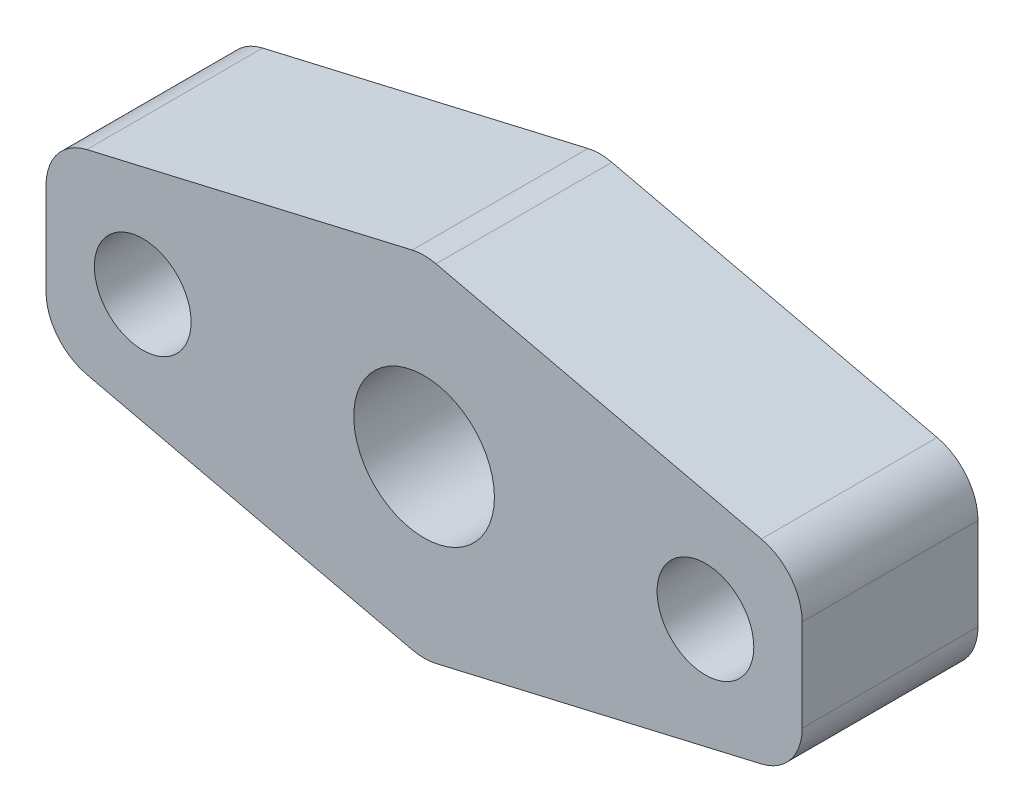
ISO-10303-21;
HEADER;
FILE_DESCRIPTION(('STEP AP214'),'2;1');
FILE_NAME('part.step','',(''),(''),'','','');
FILE_SCHEMA(('AUTOMOTIVE_DESIGN { 1 0 10303 214 1 1 1 1 }'));
ENDSEC;
DATA;
#1=APPLICATION_CONTEXT('core data for automotive mechanical design processes');
#2=APPLICATION_PROTOCOL_DEFINITION('international standard','automotive_design',2000,#1);
#3=PRODUCT_CONTEXT('',#1,'mechanical');
#4=PRODUCT('Part','Part','',(#3));
#5=PRODUCT_RELATED_PRODUCT_CATEGORY('part','',(#4));
#6=PRODUCT_DEFINITION_FORMATION('','',#4);
#7=PRODUCT_DEFINITION_CONTEXT('part definition',#1,'design');
#8=PRODUCT_DEFINITION('design','',#6,#7);
#9=PRODUCT_DEFINITION_SHAPE('','',#8);
#10=(LENGTH_UNIT() NAMED_UNIT(*) SI_UNIT(.MILLI.,.METRE.));
#11=(NAMED_UNIT(*) PLANE_ANGLE_UNIT() SI_UNIT($,.RADIAN.));
#12=(NAMED_UNIT(*) SI_UNIT($,.STERADIAN.) SOLID_ANGLE_UNIT());
#13=UNCERTAINTY_MEASURE_WITH_UNIT(LENGTH_MEASURE(1.E-05),#10,'distance_accuracy_value','');
#14=(GEOMETRIC_REPRESENTATION_CONTEXT(3) GLOBAL_UNCERTAINTY_ASSIGNED_CONTEXT((#13)) GLOBAL_UNIT_ASSIGNED_CONTEXT((#10,
#11,#12)) REPRESENTATION_CONTEXT('',''));
#15=CARTESIAN_POINT('',(0.,0.,0.));
#16=DIRECTION('',(0.,0.,1.));
#17=DIRECTION('',(1.,0.,0.));
#18=AXIS2_PLACEMENT_3D('',#15,#16,#17);
#19=CARTESIAN_POINT('',(0.,0.,10.));
#20=DIRECTION('',(0.,0.,1.));
#21=DIRECTION('',(1.,0.,0.));
#22=AXIS2_PLACEMENT_3D('',#19,#20,#21);
#23=PLANE('',#22);
#24=CARTESIAN_POINT('',(-16.,0.,10.));
#25=DIRECTION('',(0.,0.,1.));
#26=DIRECTION('',(1.,0.,0.));
#27=AXIS2_PLACEMENT_3D('',#24,#25,#26);
#28=CIRCLE('',#27,2.75);
#29=CARTESIAN_POINT('',(-13.25,0.,10.));
#30=VERTEX_POINT('',#29);
#31=EDGE_CURVE('E238',#30,#30,#28,.T.);
#32=ORIENTED_EDGE('',*,*,#31,.F.);
#33=EDGE_LOOP('',(#32));
#34=FACE_BOUND('',#33,.T.);
#35=DIRECTION('',(0.974008027039196,-0.226513494660278,0.));
#36=VECTOR('',#35,1.);
#37=CARTESIAN_POINT('',(0.,-10.,10.));
#38=LINE('',#37,#36);
#39=CARTESIAN_POINT('',(-19.1795404839808,-5.53964174791143,10.));
#40=VERTEX_POINT('',#39);
#41=CARTESIAN_POINT('',(-0.679540483980835,-9.84196732930678,10.));
#42=VERTEX_POINT('',#41);
#43=EDGE_CURVE('E229',#40,#42,#38,.T.);
#44=ORIENTED_EDGE('',*,*,#43,.T.);
#45=CARTESIAN_POINT('',(0.,-6.9199432481892,10.));
#46=DIRECTION('',(0.,0.,1.));
#47=DIRECTION('',(1.,0.,0.));
#48=AXIS2_PLACEMENT_3D('',#45,#46,#47);
#49=CIRCLE('',#48,3.);
#50=CARTESIAN_POINT('',(0.679540483980834,-9.84196732930678,10.));
#51=VERTEX_POINT('',#50);
#52=EDGE_CURVE('E181',#42,#51,#49,.T.);
#53=ORIENTED_EDGE('',*,*,#52,.T.);
#54=DIRECTION('',(0.974008027039197,0.226513494660278,0.));
#55=VECTOR('',#54,1.);
#56=CARTESIAN_POINT('',(21.5,-5.,10.));
#57=LINE('',#56,#55);
#58=CARTESIAN_POINT('',(19.1795404839808,-5.53964174791144,10.));
#59=VERTEX_POINT('',#58);
#60=EDGE_CURVE('E143',#51,#59,#57,.T.);
#61=ORIENTED_EDGE('',*,*,#60,.T.);
#62=CARTESIAN_POINT('',(18.5,-2.61761766679385,10.));
#63=DIRECTION('',(0.,0.,1.));
#64=DIRECTION('',(1.,0.,0.));
#65=AXIS2_PLACEMENT_3D('',#62,#63,#64);
#66=CIRCLE('',#65,3.);
#67=CARTESIAN_POINT('',(21.5,-2.61761766679385,10.));
#68=VERTEX_POINT('',#67);
#69=EDGE_CURVE('E55',#59,#68,#66,.T.);
#70=ORIENTED_EDGE('',*,*,#69,.T.);
#71=DIRECTION('',(0.,1.,0.));
#72=VECTOR('',#71,1.);
#73=CARTESIAN_POINT('',(21.5,-5.,10.));
#74=LINE('',#73,#72);
#75=CARTESIAN_POINT('',(21.5,2.61761766679384,10.));
#76=VERTEX_POINT('',#75);
#77=EDGE_CURVE('E160',#68,#76,#74,.T.);
#78=ORIENTED_EDGE('',*,*,#77,.T.);
#79=CARTESIAN_POINT('',(18.5,2.61761766679384,10.));
#80=DIRECTION('',(0.,0.,1.));
#81=DIRECTION('',(1.,0.,0.));
#82=AXIS2_PLACEMENT_3D('',#79,#80,#81);
#83=CIRCLE('',#82,3.);
#84=CARTESIAN_POINT('',(19.1795404839808,5.53964174791143,10.));
#85=VERTEX_POINT('',#84);
#86=EDGE_CURVE('E174',#76,#85,#83,.T.);
#87=ORIENTED_EDGE('',*,*,#86,.T.);
#88=DIRECTION('',(-0.974008027039197,0.226513494660278,0.));
#89=VECTOR('',#88,1.);
#90=CARTESIAN_POINT('',(0.,10.,10.));
#91=LINE('',#90,#89);
#92=CARTESIAN_POINT('',(0.679540483980838,9.84196732930678,10.));
#93=VERTEX_POINT('',#92);
#94=EDGE_CURVE('E154',#85,#93,#91,.T.);
#95=ORIENTED_EDGE('',*,*,#94,.T.);
#96=CARTESIAN_POINT('',(0.,6.91994324818919,10.));
#97=DIRECTION('',(0.,0.,1.));
#98=DIRECTION('',(1.,0.,0.));
#99=AXIS2_PLACEMENT_3D('',#96,#97,#98);
#100=CIRCLE('',#99,3.);
#101=CARTESIAN_POINT('',(-0.679540483980831,9.84196732930678,10.));
#102=VERTEX_POINT('',#101);
#103=EDGE_CURVE('E172',#93,#102,#100,.T.);
#104=ORIENTED_EDGE('',*,*,#103,.T.);
#105=DIRECTION('',(-0.974008027039197,-0.226513494660278,0.));
#106=VECTOR('',#105,1.);
#107=CARTESIAN_POINT('',(0.,10.,10.));
#108=LINE('',#107,#106);
#109=CARTESIAN_POINT('',(-19.1795404839808,5.53964174791144,10.));
#110=VERTEX_POINT('',#109);
#111=EDGE_CURVE('E212',#102,#110,#108,.T.);
#112=ORIENTED_EDGE('',*,*,#111,.T.);
#113=CARTESIAN_POINT('',(-18.5,2.61761766679385,10.));
#114=DIRECTION('',(0.,0.,1.));
#115=DIRECTION('',(1.,0.,0.));
#116=AXIS2_PLACEMENT_3D('',#113,#114,#115);
#117=CIRCLE('',#116,3.);
#118=CARTESIAN_POINT('',(-21.5,2.61761766679385,10.));
#119=VERTEX_POINT('',#118);
#120=EDGE_CURVE('E177',#110,#119,#117,.T.);
#121=ORIENTED_EDGE('',*,*,#120,.T.);
#122=DIRECTION('',(0.,-1.,0.));
#123=VECTOR('',#122,1.);
#124=CARTESIAN_POINT('',(-21.5,-5.,10.));
#125=LINE('',#124,#123);
#126=CARTESIAN_POINT('',(-21.5,-2.61761766679384,10.));
#127=VERTEX_POINT('',#126);
#128=EDGE_CURVE('E231',#119,#127,#125,.T.);
#129=ORIENTED_EDGE('',*,*,#128,.T.);
#130=CARTESIAN_POINT('',(-18.5,-2.61761766679384,10.));
#131=DIRECTION('',(0.,0.,1.));
#132=DIRECTION('',(1.,0.,0.));
#133=AXIS2_PLACEMENT_3D('',#130,#131,#132);
#134=CIRCLE('',#133,3.);
#135=EDGE_CURVE('E179',#127,#40,#134,.T.);
#136=ORIENTED_EDGE('',*,*,#135,.T.);
#137=EDGE_LOOP('',(#44,#53,#61,#70,#78,#87,#95,#104,#112,#121,#129,#136));
#138=FACE_BOUND('',#137,.T.);
#139=CARTESIAN_POINT('',(0.,0.,10.));
#140=DIRECTION('',(0.,0.,1.));
#141=DIRECTION('',(1.,0.,0.));
#142=AXIS2_PLACEMENT_3D('',#139,#140,#141);
#143=CIRCLE('',#142,4.);
#144=CARTESIAN_POINT('',(4.00000000000001,0.,10.));
#145=VERTEX_POINT('',#144);
#146=EDGE_CURVE('E224',#145,#145,#143,.T.);
#147=ORIENTED_EDGE('',*,*,#146,.F.);
#148=EDGE_LOOP('',(#147));
#149=FACE_BOUND('',#148,.T.);
#150=CARTESIAN_POINT('',(16.,0.,10.));
#151=DIRECTION('',(0.,0.,1.));
#152=DIRECTION('',(1.,0.,0.));
#153=AXIS2_PLACEMENT_3D('',#150,#151,#152);
#154=CIRCLE('',#153,2.75);
#155=CARTESIAN_POINT('',(18.75,0.,10.));
#156=VERTEX_POINT('',#155);
#157=EDGE_CURVE('E244',#156,#156,#154,.T.);
#158=ORIENTED_EDGE('',*,*,#157,.F.);
#159=EDGE_LOOP('',(#158));
#160=FACE_BOUND('',#159,.T.);
#161=ADVANCED_FACE('F33',(#34,#138,#149,#160),#23,.T.);
#162=CARTESIAN_POINT('',(0.,0.,0.));
#163=DIRECTION('',(0.,0.,1.));
#164=DIRECTION('',(1.,0.,0.));
#165=AXIS2_PLACEMENT_3D('',#162,#163,#164);
#166=PLANE('',#165);
#167=DIRECTION('',(0.974008027039197,0.226513494660278,0.));
#168=VECTOR('',#167,1.);
#169=CARTESIAN_POINT('',(21.5,-5.,0.));
#170=LINE('',#169,#168);
#171=CARTESIAN_POINT('',(0.679540483980834,-9.84196732930678,0.));
#172=VERTEX_POINT('',#171);
#173=CARTESIAN_POINT('',(19.1795404839808,-5.53964174791144,0.));
#174=VERTEX_POINT('',#173);
#175=EDGE_CURVE('E141',#172,#174,#170,.T.);
#176=ORIENTED_EDGE('',*,*,#175,.F.);
#177=CARTESIAN_POINT('',(0.,-6.9199432481892,0.));
#178=DIRECTION('',(0.,0.,1.));
#179=DIRECTION('',(1.,0.,0.));
#180=AXIS2_PLACEMENT_3D('',#177,#178,#179);
#181=CIRCLE('',#180,3.);
#182=CARTESIAN_POINT('',(-0.679540483980835,-9.84196732930678,0.));
#183=VERTEX_POINT('',#182);
#184=EDGE_CURVE('E124',#172,#183,#181,.F.);
#185=ORIENTED_EDGE('',*,*,#184,.T.);
#186=DIRECTION('',(0.974008027039196,-0.226513494660278,0.));
#187=VECTOR('',#186,1.);
#188=CARTESIAN_POINT('',(0.,-10.,0.));
#189=LINE('',#188,#187);
#190=CARTESIAN_POINT('',(-19.1795404839808,-5.53964174791143,0.));
#191=VERTEX_POINT('',#190);
#192=EDGE_CURVE('E152',#191,#183,#189,.T.);
#193=ORIENTED_EDGE('',*,*,#192,.F.);
#194=CARTESIAN_POINT('',(-18.5,-2.61761766679384,0.));
#195=DIRECTION('',(0.,0.,1.));
#196=DIRECTION('',(1.,0.,0.));
#197=AXIS2_PLACEMENT_3D('',#194,#195,#196);
#198=CIRCLE('',#197,3.);
#199=CARTESIAN_POINT('',(-21.5,-2.61761766679384,0.));
#200=VERTEX_POINT('',#199);
#201=EDGE_CURVE('E135',#191,#200,#198,.F.);
#202=ORIENTED_EDGE('',*,*,#201,.T.);
#203=DIRECTION('',(0.,-1.,0.));
#204=VECTOR('',#203,1.);
#205=CARTESIAN_POINT('',(-21.5,-5.,0.));
#206=LINE('',#205,#204);
#207=CARTESIAN_POINT('',(-21.5,2.61761766679385,0.));
#208=VERTEX_POINT('',#207);
#209=EDGE_CURVE('E156',#208,#200,#206,.T.);
#210=ORIENTED_EDGE('',*,*,#209,.F.);
#211=CARTESIAN_POINT('',(-18.5,2.61761766679385,0.));
#212=DIRECTION('',(0.,0.,1.));
#213=DIRECTION('',(1.,0.,0.));
#214=AXIS2_PLACEMENT_3D('',#211,#212,#213);
#215=CIRCLE('',#214,3.);
#216=CARTESIAN_POINT('',(-19.1795404839808,5.53964174791144,0.));
#217=VERTEX_POINT('',#216);
#218=EDGE_CURVE('E166',#208,#217,#215,.F.);
#219=ORIENTED_EDGE('',*,*,#218,.T.);
#220=DIRECTION('',(-0.974008027039197,-0.226513494660278,0.));
#221=VECTOR('',#220,1.);
#222=CARTESIAN_POINT('',(0.,10.,0.));
#223=LINE('',#222,#221);
#224=CARTESIAN_POINT('',(-0.679540483980831,9.84196732930678,0.));
#225=VERTEX_POINT('',#224);
#226=EDGE_CURVE('E219',#225,#217,#223,.T.);
#227=ORIENTED_EDGE('',*,*,#226,.F.);
#228=CARTESIAN_POINT('',(0.,6.91994324818919,0.));
#229=DIRECTION('',(0.,0.,1.));
#230=DIRECTION('',(1.,0.,0.));
#231=AXIS2_PLACEMENT_3D('',#228,#229,#230);
#232=CIRCLE('',#231,3.);
#233=CARTESIAN_POINT('',(0.679540483980838,9.84196732930678,0.));
#234=VERTEX_POINT('',#233);
#235=EDGE_CURVE('E144',#225,#234,#232,.F.);
#236=ORIENTED_EDGE('',*,*,#235,.T.);
#237=DIRECTION('',(-0.974008027039197,0.226513494660278,0.));
#238=VECTOR('',#237,1.);
#239=CARTESIAN_POINT('',(0.,10.,0.));
#240=LINE('',#239,#238);
#241=CARTESIAN_POINT('',(19.1795404839808,5.53964174791143,0.));
#242=VERTEX_POINT('',#241);
#243=EDGE_CURVE('E204',#242,#234,#240,.T.);
#244=ORIENTED_EDGE('',*,*,#243,.F.);
#245=CARTESIAN_POINT('',(18.5,2.61761766679384,0.));
#246=DIRECTION('',(0.,0.,1.));
#247=DIRECTION('',(1.,0.,0.));
#248=AXIS2_PLACEMENT_3D('',#245,#246,#247);
#249=CIRCLE('',#248,3.);
#250=CARTESIAN_POINT('',(21.5,2.61761766679384,0.));
#251=VERTEX_POINT('',#250);
#252=EDGE_CURVE('E163',#242,#251,#249,.F.);
#253=ORIENTED_EDGE('',*,*,#252,.T.);
#254=DIRECTION('',(0.,1.,0.));
#255=VECTOR('',#254,1.);
#256=CARTESIAN_POINT('',(21.5,-5.,0.));
#257=LINE('',#256,#255);
#258=CARTESIAN_POINT('',(21.5,-2.61761766679385,0.));
#259=VERTEX_POINT('',#258);
#260=EDGE_CURVE('E151',#259,#251,#257,.T.);
#261=ORIENTED_EDGE('',*,*,#260,.F.);
#262=CARTESIAN_POINT('',(18.5,-2.61761766679385,0.));
#263=DIRECTION('',(0.,0.,1.));
#264=DIRECTION('',(1.,0.,0.));
#265=AXIS2_PLACEMENT_3D('',#262,#263,#264);
#266=CIRCLE('',#265,3.);
#267=EDGE_CURVE('E150',#259,#174,#266,.F.);
#268=ORIENTED_EDGE('',*,*,#267,.T.);
#269=EDGE_LOOP('',(#176,#185,#193,#202,#210,#219,#227,#236,#244,#253,#261,#268));
#270=FACE_BOUND('',#269,.T.);
#271=CARTESIAN_POINT('',(0.,0.,0.));
#272=DIRECTION('',(0.,0.,1.));
#273=DIRECTION('',(1.,0.,0.));
#274=AXIS2_PLACEMENT_3D('',#271,#272,#273);
#275=CIRCLE('',#274,4.);
#276=CARTESIAN_POINT('',(4.00000000000001,0.,0.));
#277=VERTEX_POINT('',#276);
#278=EDGE_CURVE('E235',#277,#277,#275,.T.);
#279=ORIENTED_EDGE('',*,*,#278,.T.);
#280=EDGE_LOOP('',(#279));
#281=FACE_BOUND('',#280,.T.);
#282=CARTESIAN_POINT('',(-16.,0.,0.));
#283=DIRECTION('',(0.,0.,1.));
#284=DIRECTION('',(1.,0.,0.));
#285=AXIS2_PLACEMENT_3D('',#282,#283,#284);
#286=CIRCLE('',#285,2.75);
#287=CARTESIAN_POINT('',(-13.25,0.,0.));
#288=VERTEX_POINT('',#287);
#289=EDGE_CURVE('E241',#288,#288,#286,.T.);
#290=ORIENTED_EDGE('',*,*,#289,.T.);
#291=EDGE_LOOP('',(#290));
#292=FACE_BOUND('',#291,.T.);
#293=CARTESIAN_POINT('',(16.,0.,0.));
#294=DIRECTION('',(0.,0.,1.));
#295=DIRECTION('',(1.,0.,0.));
#296=AXIS2_PLACEMENT_3D('',#293,#294,#295);
#297=CIRCLE('',#296,2.75);
#298=CARTESIAN_POINT('',(18.75,0.,0.));
#299=VERTEX_POINT('',#298);
#300=EDGE_CURVE('E247',#299,#299,#297,.T.);
#301=ORIENTED_EDGE('',*,*,#300,.T.);
#302=EDGE_LOOP('',(#301));
#303=FACE_BOUND('',#302,.T.);
#304=ADVANCED_FACE('F147',(#270,#281,#292,#303),#166,.F.);
#305=CARTESIAN_POINT('',(0.,10.,10.));
#306=DIRECTION('',(-0.226513494660278,-0.974008027039196,0.));
#307=DIRECTION('',(0.974008027039196,-0.226513494660278,0.));
#308=AXIS2_PLACEMENT_3D('',#305,#306,#307);
#309=PLANE('',#308);
#310=ORIENTED_EDGE('',*,*,#94,.F.);
#311=DIRECTION('',(0.,0.,-1.));
#312=VECTOR('',#311,1.);
#313=CARTESIAN_POINT('',(19.1795404839808,5.53964174791143,10.));
#314=LINE('',#313,#312);
#315=EDGE_CURVE('E11',#85,#242,#314,.T.);
#316=ORIENTED_EDGE('',*,*,#315,.T.);
#317=ORIENTED_EDGE('',*,*,#243,.T.);
#318=DIRECTION('',(0.,0.,-1.));
#319=VECTOR('',#318,1.);
#320=CARTESIAN_POINT('',(0.679540483980838,9.84196732930678,10.));
#321=LINE('',#320,#319);
#322=EDGE_CURVE('E41',#234,#93,#321,.F.);
#323=ORIENTED_EDGE('',*,*,#322,.T.);
#324=EDGE_LOOP('',(#310,#316,#317,#323));
#325=FACE_BOUND('',#324,.T.);
#326=ADVANCED_FACE('F201',(#325),#309,.F.);
#327=CARTESIAN_POINT('',(0.,10.,10.));
#328=DIRECTION('',(0.226513494660278,-0.974008027039197,0.));
#329=DIRECTION('',(0.974008027039197,0.226513494660278,0.));
#330=AXIS2_PLACEMENT_3D('',#327,#328,#329);
#331=PLANE('',#330);
#332=ORIENTED_EDGE('',*,*,#226,.T.);
#333=DIRECTION('',(0.,0.,-1.));
#334=VECTOR('',#333,1.);
#335=CARTESIAN_POINT('',(-19.1795404839808,5.53964174791144,10.));
#336=LINE('',#335,#334);
#337=EDGE_CURVE('E191',#217,#110,#336,.F.);
#338=ORIENTED_EDGE('',*,*,#337,.T.);
#339=ORIENTED_EDGE('',*,*,#111,.F.);
#340=DIRECTION('',(0.,0.,-1.));
#341=VECTOR('',#340,1.);
#342=CARTESIAN_POINT('',(-0.679540483980831,9.84196732930678,10.));
#343=LINE('',#342,#341);
#344=EDGE_CURVE('E188',#102,#225,#343,.T.);
#345=ORIENTED_EDGE('',*,*,#344,.T.);
#346=EDGE_LOOP('',(#332,#338,#339,#345));
#347=FACE_BOUND('',#346,.T.);
#348=ADVANCED_FACE('F218',(#347),#331,.F.);
#349=CARTESIAN_POINT('',(-21.5,-5.,10.));
#350=DIRECTION('',(1.,0.,0.));
#351=DIRECTION('',(0.,0.,-1.));
#352=AXIS2_PLACEMENT_3D('',#349,#350,#351);
#353=PLANE('',#352);
#354=ORIENTED_EDGE('',*,*,#209,.T.);
#355=DIRECTION('',(0.,0.,-1.));
#356=VECTOR('',#355,1.);
#357=CARTESIAN_POINT('',(-21.5,-2.61761766679384,10.));
#358=LINE('',#357,#356);
#359=EDGE_CURVE('E186',#200,#127,#358,.F.);
#360=ORIENTED_EDGE('',*,*,#359,.T.);
#361=ORIENTED_EDGE('',*,*,#128,.F.);
#362=DIRECTION('',(0.,0.,-1.));
#363=VECTOR('',#362,1.);
#364=CARTESIAN_POINT('',(-21.5,2.61761766679385,10.));
#365=LINE('',#364,#363);
#366=EDGE_CURVE('E183',#119,#208,#365,.T.);
#367=ORIENTED_EDGE('',*,*,#366,.T.);
#368=EDGE_LOOP('',(#354,#360,#361,#367));
#369=FACE_BOUND('',#368,.T.);
#370=ADVANCED_FACE('F276',(#369),#353,.F.);
#371=CARTESIAN_POINT('',(0.,-10.,10.));
#372=DIRECTION('',(0.226513494660278,0.974008027039196,0.));
#373=DIRECTION('',(-0.974008027039196,0.226513494660278,0.));
#374=AXIS2_PLACEMENT_3D('',#371,#372,#373);
#375=PLANE('',#374);
#376=ORIENTED_EDGE('',*,*,#192,.T.);
#377=DIRECTION('',(0.,0.,-1.));
#378=VECTOR('',#377,1.);
#379=CARTESIAN_POINT('',(-0.679540483980836,-9.84196732930678,10.));
#380=LINE('',#379,#378);
#381=EDGE_CURVE('E129',#183,#42,#380,.F.);
#382=ORIENTED_EDGE('',*,*,#381,.T.);
#383=ORIENTED_EDGE('',*,*,#43,.F.);
#384=DIRECTION('',(0.,0.,-1.));
#385=VECTOR('',#384,1.);
#386=CARTESIAN_POINT('',(-19.1795404839808,-5.53964174791143,10.));
#387=LINE('',#386,#385);
#388=EDGE_CURVE('E134',#40,#191,#387,.T.);
#389=ORIENTED_EDGE('',*,*,#388,.T.);
#390=EDGE_LOOP('',(#376,#382,#383,#389));
#391=FACE_BOUND('',#390,.T.);
#392=ADVANCED_FACE('F273',(#391),#375,.F.);
#393=CARTESIAN_POINT('',(21.5,-5.,10.));
#394=DIRECTION('',(-0.226513494660278,0.974008027039197,0.));
#395=DIRECTION('',(-0.974008027039197,-0.226513494660278,0.));
#396=AXIS2_PLACEMENT_3D('',#393,#394,#395);
#397=PLANE('',#396);
#398=ORIENTED_EDGE('',*,*,#60,.F.);
#399=DIRECTION('',(0.,0.,-1.));
#400=VECTOR('',#399,1.);
#401=CARTESIAN_POINT('',(0.679540483980837,-9.84196732930678,10.));
#402=LINE('',#401,#400);
#403=EDGE_CURVE('E128',#51,#172,#402,.T.);
#404=ORIENTED_EDGE('',*,*,#403,.T.);
#405=ORIENTED_EDGE('',*,*,#175,.T.);
#406=DIRECTION('',(0.,0.,-1.));
#407=VECTOR('',#406,1.);
#408=CARTESIAN_POINT('',(19.1795404839808,-5.53964174791144,10.));
#409=LINE('',#408,#407);
#410=EDGE_CURVE('E145',#174,#59,#409,.F.);
#411=ORIENTED_EDGE('',*,*,#410,.T.);
#412=EDGE_LOOP('',(#398,#404,#405,#411));
#413=FACE_BOUND('',#412,.T.);
#414=ADVANCED_FACE('F140',(#413),#397,.F.);
#415=CARTESIAN_POINT('',(21.5,-5.,10.));
#416=DIRECTION('',(-1.,0.,0.));
#417=DIRECTION('',(0.,0.,1.));
#418=AXIS2_PLACEMENT_3D('',#415,#416,#417);
#419=PLANE('',#418);
#420=ORIENTED_EDGE('',*,*,#77,.F.);
#421=DIRECTION('',(0.,0.,-1.));
#422=VECTOR('',#421,1.);
#423=CARTESIAN_POINT('',(21.5,-2.61761766679385,10.));
#424=LINE('',#423,#422);
#425=EDGE_CURVE('E194',#68,#259,#424,.T.);
#426=ORIENTED_EDGE('',*,*,#425,.T.);
#427=ORIENTED_EDGE('',*,*,#260,.T.);
#428=DIRECTION('',(0.,0.,-1.));
#429=VECTOR('',#428,1.);
#430=CARTESIAN_POINT('',(21.5,2.61761766679384,10.));
#431=LINE('',#430,#429);
#432=EDGE_CURVE('E48',#251,#76,#431,.F.);
#433=ORIENTED_EDGE('',*,*,#432,.T.);
#434=EDGE_LOOP('',(#420,#426,#427,#433));
#435=FACE_BOUND('',#434,.T.);
#436=ADVANCED_FACE('F268',(#435),#419,.F.);
#437=CARTESIAN_POINT('',(0.,0.,10.));
#438=DIRECTION('',(0.,0.,-1.));
#439=DIRECTION('',(-1.,0.,0.));
#440=AXIS2_PLACEMENT_3D('',#437,#438,#439);
#441=CYLINDRICAL_SURFACE('',#440,4.);
#442=ORIENTED_EDGE('',*,*,#146,.T.);
#443=EDGE_LOOP('',(#442));
#444=FACE_BOUND('',#443,.T.);
#445=ORIENTED_EDGE('',*,*,#278,.F.);
#446=EDGE_LOOP('',(#445));
#447=FACE_BOUND('',#446,.T.);
#448=ADVANCED_FACE('F265',(#444,#447),#441,.F.);
#449=CARTESIAN_POINT('',(-16.,0.,10.));
#450=DIRECTION('',(0.,0.,-1.));
#451=DIRECTION('',(-1.,0.,0.));
#452=AXIS2_PLACEMENT_3D('',#449,#450,#451);
#453=CYLINDRICAL_SURFACE('',#452,2.75);
#454=ORIENTED_EDGE('',*,*,#31,.T.);
#455=EDGE_LOOP('',(#454));
#456=FACE_BOUND('',#455,.T.);
#457=ORIENTED_EDGE('',*,*,#289,.F.);
#458=EDGE_LOOP('',(#457));
#459=FACE_BOUND('',#458,.T.);
#460=ADVANCED_FACE('F399',(#456,#459),#453,.F.);
#461=CARTESIAN_POINT('',(16.,0.,10.));
#462=DIRECTION('',(0.,0.,-1.));
#463=DIRECTION('',(-1.,0.,0.));
#464=AXIS2_PLACEMENT_3D('',#461,#462,#463);
#465=CYLINDRICAL_SURFACE('',#464,2.75);
#466=ORIENTED_EDGE('',*,*,#157,.T.);
#467=EDGE_LOOP('',(#466));
#468=FACE_BOUND('',#467,.T.);
#469=ORIENTED_EDGE('',*,*,#300,.F.);
#470=EDGE_LOOP('',(#469));
#471=FACE_BOUND('',#470,.T.);
#472=ADVANCED_FACE('F253',(#468,#471),#465,.F.);
#473=CARTESIAN_POINT('',(0.,-6.9199432481892,10.));
#474=DIRECTION('',(0.,0.,-1.));
#475=DIRECTION('',(-1.,0.,0.));
#476=AXIS2_PLACEMENT_3D('',#473,#474,#475);
#477=CYLINDRICAL_SURFACE('',#476,3.);
#478=ORIENTED_EDGE('',*,*,#52,.F.);
#479=ORIENTED_EDGE('',*,*,#381,.F.);
#480=ORIENTED_EDGE('',*,*,#184,.F.);
#481=ORIENTED_EDGE('',*,*,#403,.F.);
#482=EDGE_LOOP('',(#478,#479,#480,#481));
#483=FACE_BOUND('',#482,.T.);
#484=ADVANCED_FACE('F127',(#483),#477,.T.);
#485=CARTESIAN_POINT('',(-18.5,-2.61761766679384,10.));
#486=DIRECTION('',(0.,0.,-1.));
#487=DIRECTION('',(-1.,0.,0.));
#488=AXIS2_PLACEMENT_3D('',#485,#486,#487);
#489=CYLINDRICAL_SURFACE('',#488,3.);
#490=ORIENTED_EDGE('',*,*,#135,.F.);
#491=ORIENTED_EDGE('',*,*,#359,.F.);
#492=ORIENTED_EDGE('',*,*,#201,.F.);
#493=ORIENTED_EDGE('',*,*,#388,.F.);
#494=EDGE_LOOP('',(#490,#491,#492,#493));
#495=FACE_BOUND('',#494,.T.);
#496=ADVANCED_FACE('F287',(#495),#489,.T.);
#497=CARTESIAN_POINT('',(-18.5,2.61761766679385,10.));
#498=DIRECTION('',(0.,0.,-1.));
#499=DIRECTION('',(-1.,0.,0.));
#500=AXIS2_PLACEMENT_3D('',#497,#498,#499);
#501=CYLINDRICAL_SURFACE('',#500,3.);
#502=ORIENTED_EDGE('',*,*,#120,.F.);
#503=ORIENTED_EDGE('',*,*,#337,.F.);
#504=ORIENTED_EDGE('',*,*,#218,.F.);
#505=ORIENTED_EDGE('',*,*,#366,.F.);
#506=EDGE_LOOP('',(#502,#503,#504,#505));
#507=FACE_BOUND('',#506,.T.);
#508=ADVANCED_FACE('F290',(#507),#501,.T.);
#509=CARTESIAN_POINT('',(18.5,-2.61761766679385,10.));
#510=DIRECTION('',(0.,0.,-1.));
#511=DIRECTION('',(-1.,0.,0.));
#512=AXIS2_PLACEMENT_3D('',#509,#510,#511);
#513=CYLINDRICAL_SURFACE('',#512,3.);
#514=ORIENTED_EDGE('',*,*,#69,.F.);
#515=ORIENTED_EDGE('',*,*,#410,.F.);
#516=ORIENTED_EDGE('',*,*,#267,.F.);
#517=ORIENTED_EDGE('',*,*,#425,.F.);
#518=EDGE_LOOP('',(#514,#515,#516,#517));
#519=FACE_BOUND('',#518,.T.);
#520=ADVANCED_FACE('F294',(#519),#513,.T.);
#521=CARTESIAN_POINT('',(18.5,2.61761766679384,10.));
#522=DIRECTION('',(0.,0.,-1.));
#523=DIRECTION('',(-1.,0.,0.));
#524=AXIS2_PLACEMENT_3D('',#521,#522,#523);
#525=CYLINDRICAL_SURFACE('',#524,3.);
#526=ORIENTED_EDGE('',*,*,#86,.F.);
#527=ORIENTED_EDGE('',*,*,#432,.F.);
#528=ORIENTED_EDGE('',*,*,#252,.F.);
#529=ORIENTED_EDGE('',*,*,#315,.F.);
#530=EDGE_LOOP('',(#526,#527,#528,#529));
#531=FACE_BOUND('',#530,.T.);
#532=ADVANCED_FACE('F297',(#531),#525,.T.);
#533=CARTESIAN_POINT('',(0.,6.91994324818919,10.));
#534=DIRECTION('',(0.,0.,-1.));
#535=DIRECTION('',(-1.,0.,0.));
#536=AXIS2_PLACEMENT_3D('',#533,#534,#535);
#537=CYLINDRICAL_SURFACE('',#536,3.);
#538=ORIENTED_EDGE('',*,*,#103,.F.);
#539=ORIENTED_EDGE('',*,*,#322,.F.);
#540=ORIENTED_EDGE('',*,*,#235,.F.);
#541=ORIENTED_EDGE('',*,*,#344,.F.);
#542=EDGE_LOOP('',(#538,#539,#540,#541));
#543=FACE_BOUND('',#542,.T.);
#544=ADVANCED_FACE('F35',(#543),#537,.T.);
#545=CLOSED_SHELL('',(#161,#304,#326,#348,#370,#392,#414,#436,#448,#460,#472,#484,#496,#508,
#520,#532,#544));
#546=MANIFOLD_SOLID_BREP('B2',#545);
#547=ADVANCED_BREP_SHAPE_REPRESENTATION('',(#18,#546),#14);
#548=SHAPE_DEFINITION_REPRESENTATION(#9,#547);
ENDSEC;
END-ISO-10303-21;
